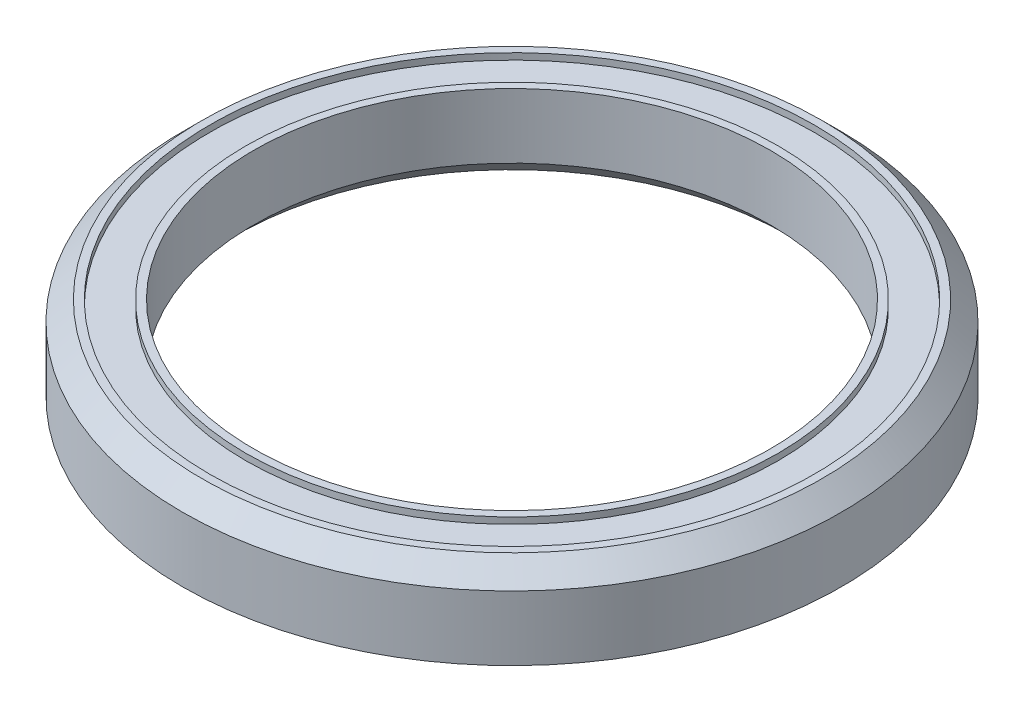
ISO-10303-21;
HEADER;
FILE_DESCRIPTION(('STEP AP214'),'2;1');
FILE_NAME('part.step','',(''),(''),'','','');
FILE_SCHEMA(('AUTOMOTIVE_DESIGN { 1 0 10303 214 1 1 1 1 }'));
ENDSEC;
DATA;
#1=APPLICATION_CONTEXT('core data for automotive mechanical design processes');
#2=APPLICATION_PROTOCOL_DEFINITION('international standard','automotive_design',2000,#1);
#3=PRODUCT_CONTEXT('',#1,'mechanical');
#4=PRODUCT('Part','Part','',(#3));
#5=PRODUCT_RELATED_PRODUCT_CATEGORY('part','',(#4));
#6=PRODUCT_DEFINITION_FORMATION('','',#4);
#7=PRODUCT_DEFINITION_CONTEXT('part definition',#1,'design');
#8=PRODUCT_DEFINITION('design','',#6,#7);
#9=PRODUCT_DEFINITION_SHAPE('','',#8);
#10=(LENGTH_UNIT() NAMED_UNIT(*) SI_UNIT(.MILLI.,.METRE.));
#11=(NAMED_UNIT(*) PLANE_ANGLE_UNIT() SI_UNIT($,.RADIAN.));
#12=(NAMED_UNIT(*) SI_UNIT($,.STERADIAN.) SOLID_ANGLE_UNIT());
#13=UNCERTAINTY_MEASURE_WITH_UNIT(LENGTH_MEASURE(1.E-05),#10,'distance_accuracy_value','');
#14=(GEOMETRIC_REPRESENTATION_CONTEXT(3) GLOBAL_UNCERTAINTY_ASSIGNED_CONTEXT((#13)) GLOBAL_UNIT_ASSIGNED_CONTEXT((#10,
#11,#12)) REPRESENTATION_CONTEXT('',''));
#15=CARTESIAN_POINT('',(0.,0.,0.));
#16=DIRECTION('',(0.,0.,1.));
#17=DIRECTION('',(1.,0.,0.));
#18=AXIS2_PLACEMENT_3D('',#15,#16,#17);
#19=CARTESIAN_POINT('',(0.,0.,0.));
#20=DIRECTION('',(0.,1.,0.));
#21=DIRECTION('',(0.,0.,1.));
#22=AXIS2_PLACEMENT_3D('',#19,#20,#21);
#23=PLANE('',#22);
#24=CARTESIAN_POINT('',(0.,0.,0.));
#25=DIRECTION('',(0.,1.,0.));
#26=DIRECTION('',(0.,0.,1.));
#27=AXIS2_PLACEMENT_3D('',#24,#25,#26);
#28=CIRCLE('',#27,21.5);
#29=CARTESIAN_POINT('',(0.,0.,21.5));
#30=VERTEX_POINT('',#29);
#31=EDGE_CURVE('E50',#30,#30,#28,.T.);
#32=ORIENTED_EDGE('',*,*,#31,.T.);
#33=EDGE_LOOP('',(#32));
#34=FACE_BOUND('',#33,.T.);
#35=CARTESIAN_POINT('',(0.,0.,0.));
#36=DIRECTION('',(0.,-1.,0.));
#37=DIRECTION('',(0.,0.,-1.));
#38=AXIS2_PLACEMENT_3D('',#35,#36,#37);
#39=CIRCLE('',#38,22.1);
#40=CARTESIAN_POINT('',(0.,0.,-22.1));
#41=VERTEX_POINT('',#40);
#42=EDGE_CURVE('E99',#41,#41,#39,.T.);
#43=ORIENTED_EDGE('',*,*,#42,.T.);
#44=EDGE_LOOP('',(#43));
#45=FACE_BOUND('',#44,.T.);
#46=ADVANCED_FACE('F41',(#34,#45),#23,.F.);
#47=CARTESIAN_POINT('',(0.,6.5,0.));
#48=DIRECTION('',(0.,1.,0.));
#49=DIRECTION('',(0.,0.,1.));
#50=AXIS2_PLACEMENT_3D('',#47,#48,#49);
#51=PLANE('',#50);
#52=CARTESIAN_POINT('',(0.,6.5,0.));
#53=DIRECTION('',(0.,1.,0.));
#54=DIRECTION('',(0.,0.,1.));
#55=AXIS2_PLACEMENT_3D('',#52,#53,#54);
#56=CIRCLE('',#55,20.);
#57=CARTESIAN_POINT('',(0.,6.5,-20.));
#58=VERTEX_POINT('',#57);
#59=EDGE_CURVE('E70',#58,#58,#56,.T.);
#60=ORIENTED_EDGE('',*,*,#59,.F.);
#61=EDGE_LOOP('',(#60));
#62=FACE_BOUND('',#61,.T.);
#63=CARTESIAN_POINT('',(0.,6.5,0.));
#64=DIRECTION('',(0.,1.,0.));
#65=DIRECTION('',(0.,0.,1.));
#66=AXIS2_PLACEMENT_3D('',#63,#64,#65);
#67=CIRCLE('',#66,20.6);
#68=CARTESIAN_POINT('',(0.,6.5,20.6));
#69=VERTEX_POINT('',#68);
#70=EDGE_CURVE('E83',#69,#69,#67,.T.);
#71=ORIENTED_EDGE('',*,*,#70,.T.);
#72=EDGE_LOOP('',(#71));
#73=FACE_BOUND('',#72,.T.);
#74=ADVANCED_FACE('F141',(#62,#73),#51,.T.);
#75=CARTESIAN_POINT('',(0.,6.5,0.));
#76=DIRECTION('',(0.,1.,0.));
#77=DIRECTION('',(0.,0.,1.));
#78=AXIS2_PLACEMENT_3D('',#75,#76,#77);
#79=CIRCLE('',#78,23.4000000000001);
#80=CARTESIAN_POINT('',(0.,6.5,23.4000000000001));
#81=VERTEX_POINT('',#80);
#82=EDGE_CURVE('E75',#81,#81,#79,.T.);
#83=ORIENTED_EDGE('',*,*,#82,.F.);
#84=EDGE_LOOP('',(#83));
#85=FACE_BOUND('',#84,.T.);
#86=CARTESIAN_POINT('',(0.,6.5,0.));
#87=DIRECTION('',(0.,1.,0.));
#88=DIRECTION('',(0.,0.,1.));
#89=AXIS2_PLACEMENT_3D('',#86,#87,#88);
#90=CIRCLE('',#89,24.0000000000001);
#91=CARTESIAN_POINT('',(0.,6.5,-24.0000000000001));
#92=VERTEX_POINT('',#91);
#93=EDGE_CURVE('E60',#92,#92,#90,.T.);
#94=ORIENTED_EDGE('',*,*,#93,.T.);
#95=EDGE_LOOP('',(#94));
#96=FACE_BOUND('',#95,.T.);
#97=ADVANCED_FACE('F127',(#85,#96),#51,.T.);
#98=CARTESIAN_POINT('',(0.,0.,0.));
#99=DIRECTION('',(0.,-1.,0.));
#100=DIRECTION('',(0.,0.,-1.));
#101=AXIS2_PLACEMENT_3D('',#98,#99,#100);
#102=CIRCLE('',#101,24.9);
#103=CARTESIAN_POINT('',(0.,0.,-24.9));
#104=VERTEX_POINT('',#103);
#105=EDGE_CURVE('E91',#104,#104,#102,.T.);
#106=ORIENTED_EDGE('',*,*,#105,.F.);
#107=EDGE_LOOP('',(#106));
#108=FACE_BOUND('',#107,.T.);
#109=CARTESIAN_POINT('',(0.,0.,0.));
#110=DIRECTION('',(0.,1.,0.));
#111=DIRECTION('',(0.,0.,1.));
#112=AXIS2_PLACEMENT_3D('',#109,#110,#111);
#113=CIRCLE('',#112,25.5);
#114=CARTESIAN_POINT('',(0.,0.,-25.5));
#115=VERTEX_POINT('',#114);
#116=EDGE_CURVE('E66',#115,#115,#113,.T.);
#117=ORIENTED_EDGE('',*,*,#116,.F.);
#118=EDGE_LOOP('',(#117));
#119=FACE_BOUND('',#118,.T.);
#120=ADVANCED_FACE('F123',(#108,#119),#23,.F.);
#121=CARTESIAN_POINT('',(0.,6.5,0.));
#122=DIRECTION('',(0.,-1.,0.));
#123=DIRECTION('',(0.,0.,-1.));
#124=AXIS2_PLACEMENT_3D('',#121,#122,#123);
#125=CYLINDRICAL_SURFACE('',#124,25.5);
#126=CARTESIAN_POINT('',(0.,5.00000000000004,0.));
#127=DIRECTION('',(0.,1.,0.));
#128=DIRECTION('',(0.,0.,1.));
#129=AXIS2_PLACEMENT_3D('',#126,#127,#128);
#130=CIRCLE('',#129,25.5);
#131=CARTESIAN_POINT('',(0.,5.00000000000004,-25.5));
#132=VERTEX_POINT('',#131);
#133=EDGE_CURVE('E55',#132,#132,#130,.F.);
#134=CARTESIAN_POINT('',(0.,5.00000000000004,-25.5));
#135=CARTESIAN_POINT('',(0.,4.94791666666671,-25.5));
#136=CARTESIAN_POINT('',(0.,4.89583333333338,-25.5));
#137=CARTESIAN_POINT('',(0.,4.79166666666671,-25.5));
#138=CARTESIAN_POINT('',(0.,4.73958333333337,-25.5));
#139=CARTESIAN_POINT('',(0.,4.63541666666671,-25.5));
#140=CARTESIAN_POINT('',(0.,4.58333333333337,-25.5));
#141=CARTESIAN_POINT('',(0.,4.47916666666671,-25.5));
#142=CARTESIAN_POINT('',(0.,4.42708333333337,-25.5));
#143=CARTESIAN_POINT('',(0.,4.32291666666671,-25.5));
#144=CARTESIAN_POINT('',(0.,4.27083333333337,-25.5));
#145=CARTESIAN_POINT('',(0.,4.1666666666667,-25.5));
#146=CARTESIAN_POINT('',(0.,4.11458333333337,-25.5));
#147=CARTESIAN_POINT('',(0.,4.0104166666667,-25.5));
#148=CARTESIAN_POINT('',(0.,3.95833333333337,-25.5));
#149=CARTESIAN_POINT('',(0.,3.8541666666667,-25.5));
#150=CARTESIAN_POINT('',(0.,3.80208333333337,-25.5));
#151=CARTESIAN_POINT('',(0.,3.6979166666667,-25.5));
#152=CARTESIAN_POINT('',(0.,3.64583333333336,-25.5));
#153=CARTESIAN_POINT('',(0.,3.5416666666667,-25.5));
#154=CARTESIAN_POINT('',(0.,3.48958333333336,-25.5));
#155=CARTESIAN_POINT('',(0.,3.3854166666667,-25.5));
#156=CARTESIAN_POINT('',(0.,3.33333333333336,-25.5));
#157=CARTESIAN_POINT('',(0.,3.22916666666669,-25.5));
#158=CARTESIAN_POINT('',(0.,3.17708333333336,-25.5));
#159=CARTESIAN_POINT('',(0.,3.07291666666669,-25.5));
#160=CARTESIAN_POINT('',(0.,3.02083333333336,-25.5));
#161=CARTESIAN_POINT('',(0.,2.91666666666669,-25.5));
#162=CARTESIAN_POINT('',(0.,2.86458333333336,-25.5));
#163=CARTESIAN_POINT('',(0.,2.76041666666669,-25.5));
#164=CARTESIAN_POINT('',(0.,2.70833333333336,-25.5));
#165=CARTESIAN_POINT('',(0.,2.60416666666669,-25.5));
#166=CARTESIAN_POINT('',(0.,2.55208333333335,-25.5));
#167=CARTESIAN_POINT('',(0.,2.44791666666669,-25.5));
#168=CARTESIAN_POINT('',(0.,2.39583333333335,-25.5));
#169=CARTESIAN_POINT('',(0.,2.29166666666669,-25.5));
#170=CARTESIAN_POINT('',(0.,2.23958333333335,-25.5));
#171=CARTESIAN_POINT('',(0.,2.13541666666669,-25.5));
#172=CARTESIAN_POINT('',(0.,2.08333333333335,-25.5));
#173=CARTESIAN_POINT('',(0.,1.97916666666668,-25.5));
#174=CARTESIAN_POINT('',(0.,1.92708333333335,-25.5));
#175=CARTESIAN_POINT('',(0.,1.82291666666668,-25.5));
#176=CARTESIAN_POINT('',(0.,1.77083333333335,-25.5));
#177=CARTESIAN_POINT('',(0.,1.66666666666668,-25.5));
#178=CARTESIAN_POINT('',(0.,1.61458333333335,-25.5));
#179=CARTESIAN_POINT('',(0.,1.51041666666668,-25.5));
#180=CARTESIAN_POINT('',(0.,1.45833333333335,-25.5));
#181=CARTESIAN_POINT('',(0.,1.35416666666668,-25.5));
#182=CARTESIAN_POINT('',(0.,1.30208333333334,-25.5));
#183=CARTESIAN_POINT('',(0.,1.19791666666668,-25.5));
#184=CARTESIAN_POINT('',(0.,1.14583333333334,-25.5));
#185=CARTESIAN_POINT('',(0.,1.04166666666668,-25.5));
#186=CARTESIAN_POINT('',(0.,0.989583333333342,-25.5));
#187=CARTESIAN_POINT('',(0.,0.885416666666674,-25.5));
#188=CARTESIAN_POINT('',(0.,0.83333333333334,-25.5));
#189=CARTESIAN_POINT('',(0.,0.729166666666673,-25.5));
#190=CARTESIAN_POINT('',(0.,0.677083333333339,-25.5));
#191=CARTESIAN_POINT('',(0.,0.572916666666672,-25.5));
#192=CARTESIAN_POINT('',(0.,0.520833333333338,-25.5));
#193=CARTESIAN_POINT('',(0.,0.41666666666667,-25.5));
#194=CARTESIAN_POINT('',(0.,0.364583333333336,-25.5));
#195=CARTESIAN_POINT('',(0.,0.260416666666668,-25.5));
#196=CARTESIAN_POINT('',(0.,0.208333333333334,-25.5));
#197=CARTESIAN_POINT('',(0.,0.104166666666667,-25.5));
#198=CARTESIAN_POINT('',(0.,0.0520833333333334,-25.5));
#199=CARTESIAN_POINT('',(0.,0.,-25.5));
#200=B_SPLINE_CURVE_WITH_KNOTS('',3,(#134,#135,#136,#137,#138,#139,#140,#141,#142,#143,#144,
#145,#146,#147,#148,#149,#150,#151,#152,#153,#154,#155,#156,#157,#158,#159,#160,#161,#162,#163,
#164,#165,#166,#167,#168,#169,#170,#171,#172,#173,#174,#175,#176,#177,#178,#179,#180,#181,#182,
#183,#184,#185,#186,#187,#188,#189,#190,#191,#192,#193,#194,#195,#196,#197,#198,#199),
.UNSPECIFIED.,.F.,.F.,(4,2,2,2,2,2,2,2,2,2,2,2,2,2,2,2,2,2,2,2,2,2,2,2,2,2,2,2,2,2,2,2,4),(0.,
0.156250000000002,0.312500000000003,0.468750000000005,0.625000000000005,0.781250000000007,
0.937500000000009,1.09375000000001,1.25000000000001,1.40625000000001,1.56250000000001,
1.71875000000001,1.87500000000002,2.03125000000002,2.18750000000002,2.34375000000002,
2.50000000000002,2.65625000000002,2.81250000000002,2.96875000000003,3.12500000000003,
3.28125000000003,3.43750000000003,3.59375000000003,3.75000000000003,3.90625000000003,
4.06250000000004,4.21875000000004,4.37500000000004,4.53125000000004,4.68750000000004,
4.84375000000004,5.00000000000004),.UNSPECIFIED.);
#201=EDGE_CURVE('BSEAM126',#132,#115,#200,.T.);
#202=ORIENTED_EDGE('',*,*,#133,.T.);
#203=ORIENTED_EDGE('',*,*,#116,.T.);
#204=ORIENTED_EDGE('',*,*,#201,.T.);
#205=ORIENTED_EDGE('',*,*,#201,.F.);
#206=EDGE_LOOP('',(#202,#204,#203,#205));
#207=FACE_BOUND('',#206,.T.);
#208=ADVANCED_FACE('F126',(#207),#125,.T.);
#209=CARTESIAN_POINT('',(0.,6.5,0.));
#210=DIRECTION('',(0.,-1.,0.));
#211=DIRECTION('',(0.,0.,-1.));
#212=AXIS2_PLACEMENT_3D('',#209,#210,#211);
#213=CYLINDRICAL_SURFACE('',#212,20.);
#214=CARTESIAN_POINT('',(0.,1.49999999999997,0.));
#215=DIRECTION('',(0.,1.,0.));
#216=DIRECTION('',(0.,0.,1.));
#217=AXIS2_PLACEMENT_3D('',#214,#215,#216);
#218=CIRCLE('',#217,20.);
#219=CARTESIAN_POINT('',(0.,1.49999999999997,-20.));
#220=VERTEX_POINT('',#219);
#221=EDGE_CURVE('E10',#220,#220,#218,.F.);
#222=CARTESIAN_POINT('',(0.,1.49999999999997,-20.));
#223=CARTESIAN_POINT('',(0.,1.5520833333333,-20.));
#224=CARTESIAN_POINT('',(0.,1.60416666666664,-20.));
#225=CARTESIAN_POINT('',(0.,1.7083333333333,-20.));
#226=CARTESIAN_POINT('',(0.,1.76041666666664,-20.));
#227=CARTESIAN_POINT('',(0.,1.86458333333331,-20.));
#228=CARTESIAN_POINT('',(0.,1.91666666666664,-20.));
#229=CARTESIAN_POINT('',(0.,2.02083333333331,-20.));
#230=CARTESIAN_POINT('',(0.,2.07291666666664,-20.));
#231=CARTESIAN_POINT('',(0.,2.17708333333331,-20.));
#232=CARTESIAN_POINT('',(0.,2.22916666666664,-20.));
#233=CARTESIAN_POINT('',(0.,2.33333333333331,-20.));
#234=CARTESIAN_POINT('',(0.,2.38541666666664,-20.));
#235=CARTESIAN_POINT('',(0.,2.48958333333331,-20.));
#236=CARTESIAN_POINT('',(0.,2.54166666666664,-20.));
#237=CARTESIAN_POINT('',(0.,2.64583333333331,-20.));
#238=CARTESIAN_POINT('',(0.,2.69791666666664,-20.));
#239=CARTESIAN_POINT('',(0.,2.80208333333331,-20.));
#240=CARTESIAN_POINT('',(0.,2.85416666666664,-20.));
#241=CARTESIAN_POINT('',(0.,2.95833333333331,-20.));
#242=CARTESIAN_POINT('',(0.,3.01041666666665,-20.));
#243=CARTESIAN_POINT('',(0.,3.11458333333331,-20.));
#244=CARTESIAN_POINT('',(0.,3.16666666666665,-20.));
#245=CARTESIAN_POINT('',(0.,3.27083333333331,-20.));
#246=CARTESIAN_POINT('',(0.,3.32291666666665,-20.));
#247=CARTESIAN_POINT('',(0.,3.42708333333331,-20.));
#248=CARTESIAN_POINT('',(0.,3.47916666666665,-20.));
#249=CARTESIAN_POINT('',(0.,3.58333333333332,-20.));
#250=CARTESIAN_POINT('',(0.,3.63541666666665,-20.));
#251=CARTESIAN_POINT('',(0.,3.73958333333332,-20.));
#252=CARTESIAN_POINT('',(0.,3.79166666666665,-20.));
#253=CARTESIAN_POINT('',(0.,3.89583333333332,-20.));
#254=CARTESIAN_POINT('',(0.,3.94791666666665,-20.));
#255=CARTESIAN_POINT('',(0.,4.05208333333332,-20.));
#256=CARTESIAN_POINT('',(0.,4.10416666666665,-20.));
#257=CARTESIAN_POINT('',(0.,4.20833333333332,-20.));
#258=CARTESIAN_POINT('',(0.,4.26041666666665,-20.));
#259=CARTESIAN_POINT('',(0.,4.36458333333332,-20.));
#260=CARTESIAN_POINT('',(0.,4.41666666666665,-20.));
#261=CARTESIAN_POINT('',(0.,4.52083333333332,-20.));
#262=CARTESIAN_POINT('',(0.,4.57291666666665,-20.));
#263=CARTESIAN_POINT('',(0.,4.67708333333332,-20.));
#264=CARTESIAN_POINT('',(0.,4.72916666666665,-20.));
#265=CARTESIAN_POINT('',(0.,4.83333333333332,-20.));
#266=CARTESIAN_POINT('',(0.,4.88541666666666,-20.));
#267=CARTESIAN_POINT('',(0.,4.98958333333332,-20.));
#268=CARTESIAN_POINT('',(0.,5.04166666666666,-20.));
#269=CARTESIAN_POINT('',(0.,5.14583333333332,-20.));
#270=CARTESIAN_POINT('',(0.,5.19791666666666,-20.));
#271=CARTESIAN_POINT('',(0.,5.30208333333333,-20.));
#272=CARTESIAN_POINT('',(0.,5.35416666666666,-20.));
#273=CARTESIAN_POINT('',(0.,5.45833333333333,-20.));
#274=CARTESIAN_POINT('',(0.,5.51041666666666,-20.));
#275=CARTESIAN_POINT('',(0.,5.61458333333333,-20.));
#276=CARTESIAN_POINT('',(0.,5.66666666666666,-20.));
#277=CARTESIAN_POINT('',(0.,5.77083333333333,-20.));
#278=CARTESIAN_POINT('',(0.,5.82291666666666,-20.));
#279=CARTESIAN_POINT('',(0.,5.92708333333333,-20.));
#280=CARTESIAN_POINT('',(0.,5.97916666666666,-20.));
#281=CARTESIAN_POINT('',(0.,6.08333333333333,-20.));
#282=CARTESIAN_POINT('',(0.,6.13541666666666,-20.));
#283=CARTESIAN_POINT('',(0.,6.23958333333333,-20.));
#284=CARTESIAN_POINT('',(0.,6.29166666666666,-20.));
#285=CARTESIAN_POINT('',(0.,6.39583333333333,-20.));
#286=CARTESIAN_POINT('',(0.,6.44791666666667,-20.));
#287=CARTESIAN_POINT('',(0.,6.5,-20.));
#288=B_SPLINE_CURVE_WITH_KNOTS('',3,(#222,#223,#224,#225,#226,#227,#228,#229,#230,#231,#232,
#233,#234,#235,#236,#237,#238,#239,#240,#241,#242,#243,#244,#245,#246,#247,#248,#249,#250,#251,
#252,#253,#254,#255,#256,#257,#258,#259,#260,#261,#262,#263,#264,#265,#266,#267,#268,#269,#270,
#271,#272,#273,#274,#275,#276,#277,#278,#279,#280,#281,#282,#283,#284,#285,#286,#287),
.UNSPECIFIED.,.F.,.F.,(4,2,2,2,2,2,2,2,2,2,2,2,2,2,2,2,2,2,2,2,2,2,2,2,2,2,2,2,2,2,2,2,4),(0.,
0.156250000000001,0.312500000000002,0.468750000000003,0.625000000000004,0.781250000000004,
0.937500000000006,1.09375000000001,1.25000000000001,1.40625000000001,1.56250000000001,
1.71875000000001,1.87500000000001,2.03125000000001,2.18750000000001,2.34375000000001,
2.50000000000001,2.65625000000002,2.81250000000002,2.96875000000002,3.12500000000002,
3.28125000000002,3.43750000000002,3.59375000000002,3.75000000000002,3.90625000000002,
4.06250000000002,4.21875000000002,4.37500000000002,4.53125000000003,4.68750000000003,
4.84375000000003,5.00000000000003),.UNSPECIFIED.);
#289=EDGE_CURVE('BSEAM132',#220,#58,#288,.T.);
#290=ORIENTED_EDGE('',*,*,#221,.T.);
#291=ORIENTED_EDGE('',*,*,#59,.T.);
#292=ORIENTED_EDGE('',*,*,#289,.T.);
#293=ORIENTED_EDGE('',*,*,#289,.F.);
#294=EDGE_LOOP('',(#290,#292,#291,#293));
#295=FACE_BOUND('',#294,.T.);
#296=ADVANCED_FACE('F132',(#295),#213,.F.);
#297=CARTESIAN_POINT('',(0.,6.5,0.));
#298=DIRECTION('',(0.,-1.,0.));
#299=DIRECTION('',(0.,0.,-1.));
#300=AXIS2_PLACEMENT_3D('',#297,#298,#299);
#301=CONICAL_SURFACE('',#300,24.0000000000001,0.785398163397445);
#302=CARTESIAN_POINT('',(0.,5.00000000000004,-25.5));
#303=CARTESIAN_POINT('',(0.,5.01562500000004,-25.484375));
#304=CARTESIAN_POINT('',(0.,5.03125000000004,-25.46875));
#305=CARTESIAN_POINT('',(0.,5.06250000000004,-25.4375));
#306=CARTESIAN_POINT('',(0.,5.07812500000004,-25.421875));
#307=CARTESIAN_POINT('',(0.,5.10937500000004,-25.390625));
#308=CARTESIAN_POINT('',(0.,5.12500000000004,-25.375));
#309=CARTESIAN_POINT('',(0.,5.15625000000004,-25.34375));
#310=CARTESIAN_POINT('',(0.,5.17187500000004,-25.328125));
#311=CARTESIAN_POINT('',(0.,5.20312500000004,-25.296875));
#312=CARTESIAN_POINT('',(0.,5.21875000000004,-25.28125));
#313=CARTESIAN_POINT('',(0.,5.25000000000004,-25.25));
#314=CARTESIAN_POINT('',(0.,5.26562500000004,-25.234375));
#315=CARTESIAN_POINT('',(0.,5.29687500000003,-25.203125));
#316=CARTESIAN_POINT('',(0.,5.31250000000003,-25.1875));
#317=CARTESIAN_POINT('',(0.,5.34375000000003,-25.15625));
#318=CARTESIAN_POINT('',(0.,5.35937500000003,-25.140625));
#319=CARTESIAN_POINT('',(0.,5.39062500000003,-25.109375));
#320=CARTESIAN_POINT('',(0.,5.40625000000003,-25.09375));
#321=CARTESIAN_POINT('',(0.,5.43750000000003,-25.0625));
#322=CARTESIAN_POINT('',(0.,5.45312500000003,-25.046875));
#323=CARTESIAN_POINT('',(0.,5.48437500000003,-25.015625));
#324=CARTESIAN_POINT('',(0.,5.50000000000003,-25.));
#325=CARTESIAN_POINT('',(0.,5.53125000000003,-24.96875));
#326=CARTESIAN_POINT('',(0.,5.54687500000003,-24.953125));
#327=CARTESIAN_POINT('',(0.,5.57812500000003,-24.921875));
#328=CARTESIAN_POINT('',(0.,5.59375000000003,-24.90625));
#329=CARTESIAN_POINT('',(0.,5.62500000000002,-24.875));
#330=CARTESIAN_POINT('',(0.,5.64062500000002,-24.859375));
#331=CARTESIAN_POINT('',(0.,5.67187500000002,-24.828125));
#332=CARTESIAN_POINT('',(0.,5.68750000000002,-24.8125));
#333=CARTESIAN_POINT('',(0.,5.71875000000002,-24.78125));
#334=CARTESIAN_POINT('',(0.,5.73437500000002,-24.765625));
#335=CARTESIAN_POINT('',(0.,5.76562500000002,-24.734375));
#336=CARTESIAN_POINT('',(0.,5.78125000000002,-24.71875));
#337=CARTESIAN_POINT('',(0.,5.81250000000002,-24.6875));
#338=CARTESIAN_POINT('',(0.,5.82812500000002,-24.671875));
#339=CARTESIAN_POINT('',(0.,5.85937500000002,-24.640625));
#340=CARTESIAN_POINT('',(0.,5.87500000000002,-24.625));
#341=CARTESIAN_POINT('',(0.,5.90625000000002,-24.59375));
#342=CARTESIAN_POINT('',(0.,5.92187500000002,-24.578125));
#343=CARTESIAN_POINT('',(0.,5.95312500000002,-24.546875));
#344=CARTESIAN_POINT('',(0.,5.96875000000002,-24.53125));
#345=CARTESIAN_POINT('',(0.,6.00000000000001,-24.5));
#346=CARTESIAN_POINT('',(0.,6.01562500000001,-24.484375));
#347=CARTESIAN_POINT('',(0.,6.04687500000001,-24.453125));
#348=CARTESIAN_POINT('',(0.,6.06250000000001,-24.4375));
#349=CARTESIAN_POINT('',(0.,6.09375000000001,-24.40625));
#350=CARTESIAN_POINT('',(0.,6.10937500000001,-24.390625));
#351=CARTESIAN_POINT('',(0.,6.14062500000001,-24.359375));
#352=CARTESIAN_POINT('',(0.,6.15625000000001,-24.34375));
#353=CARTESIAN_POINT('',(0.,6.18750000000001,-24.3125));
#354=CARTESIAN_POINT('',(0.,6.20312500000001,-24.296875));
#355=CARTESIAN_POINT('',(0.,6.23437500000001,-24.265625));
#356=CARTESIAN_POINT('',(0.,6.25000000000001,-24.25));
#357=CARTESIAN_POINT('',(0.,6.28125000000001,-24.21875));
#358=CARTESIAN_POINT('',(0.,6.29687500000001,-24.203125));
#359=CARTESIAN_POINT('',(0.,6.328125,-24.171875));
#360=CARTESIAN_POINT('',(0.,6.34375,-24.15625));
#361=CARTESIAN_POINT('',(0.,6.375,-24.125));
#362=CARTESIAN_POINT('',(0.,6.390625,-24.109375));
#363=CARTESIAN_POINT('',(0.,6.421875,-24.078125));
#364=CARTESIAN_POINT('',(0.,6.4375,-24.0625));
#365=CARTESIAN_POINT('',(0.,6.46875,-24.0312500000001));
#366=CARTESIAN_POINT('',(0.,6.484375,-24.015625));
#367=CARTESIAN_POINT('',(0.,6.5,-24.0000000000001));
#368=B_SPLINE_CURVE_WITH_KNOTS('',3,(#302,#303,#304,#305,#306,#307,#308,#309,#310,#311,#312,
#313,#314,#315,#316,#317,#318,#319,#320,#321,#322,#323,#324,#325,#326,#327,#328,#329,#330,#331,
#332,#333,#334,#335,#336,#337,#338,#339,#340,#341,#342,#343,#344,#345,#346,#347,#348,#349,#350,
#351,#352,#353,#354,#355,#356,#357,#358,#359,#360,#361,#362,#363,#364,#365,#366,#367),
.UNSPECIFIED.,.F.,.F.,(4,2,2,2,2,2,2,2,2,2,2,2,2,2,2,2,2,2,2,2,2,2,2,2,2,2,2,2,2,2,2,2,4),(0.,
0.0662912607362364,0.132582521472474,0.19887378220871,0.265165042944946,0.331456303681183,
0.39774756441742,0.464038825153656,0.530330085889893,0.59662134662613,0.662912607362366,
0.729203868098603,0.79549512883484,0.861786389571077,0.928077650307313,0.99436891104355,
1.06066017177979,1.12695143251602,1.19324269325226,1.2595339539885,1.32582521472473,
1.39211647546097,1.45840773619721,1.52469899693344,1.59099025766968,1.65728151840592,
1.72357277914215,1.78986403987839,1.85615530061463,1.92244656135086,1.9887378220871,
2.05502908282334,2.12132034355957),.UNSPECIFIED.);
#369=EDGE_CURVE('BSEAM138',#132,#92,#368,.T.);
#370=ORIENTED_EDGE('',*,*,#133,.F.);
#371=ORIENTED_EDGE('',*,*,#93,.F.);
#372=ORIENTED_EDGE('',*,*,#369,.T.);
#373=ORIENTED_EDGE('',*,*,#369,.F.);
#374=EDGE_LOOP('',(#370,#372,#371,#373));
#375=FACE_BOUND('',#374,.T.);
#376=ADVANCED_FACE('F138',(#375),#301,.T.);
#377=CARTESIAN_POINT('',(0.,0.,0.));
#378=DIRECTION('',(0.,-1.,0.));
#379=DIRECTION('',(0.,0.,-1.));
#380=AXIS2_PLACEMENT_3D('',#377,#378,#379);
#381=CONICAL_SURFACE('',#380,21.5,0.785398163397446);
#382=ORIENTED_EDGE('',*,*,#221,.F.);
#383=EDGE_LOOP('',(#382));
#384=FACE_BOUND('',#383,.T.);
#385=ORIENTED_EDGE('',*,*,#31,.F.);
#386=EDGE_LOOP('',(#385));
#387=FACE_BOUND('',#386,.T.);
#388=ADVANCED_FACE('F44',(#384,#387),#381,.F.);
#389=CARTESIAN_POINT('',(0.,6.,0.));
#390=DIRECTION('',(0.,1.,0.));
#391=DIRECTION('',(0.,0.,1.));
#392=AXIS2_PLACEMENT_3D('',#389,#390,#391);
#393=CYLINDRICAL_SURFACE('',#392,23.4000000000001);
#394=CARTESIAN_POINT('',(0.,6.,0.));
#395=DIRECTION('',(0.,1.,0.));
#396=DIRECTION('',(0.,0.,1.));
#397=AXIS2_PLACEMENT_3D('',#394,#395,#396);
#398=CIRCLE('',#397,23.4000000000001);
#399=CARTESIAN_POINT('',(0.,6.,23.4000000000001));
#400=VERTEX_POINT('',#399);
#401=EDGE_CURVE('E74',#400,#400,#398,.T.);
#402=ORIENTED_EDGE('',*,*,#401,.F.);
#403=EDGE_LOOP('',(#402));
#404=FACE_BOUND('',#403,.T.);
#405=ORIENTED_EDGE('',*,*,#82,.T.);
#406=EDGE_LOOP('',(#405));
#407=FACE_BOUND('',#406,.T.);
#408=ADVANCED_FACE('F151',(#404,#407),#393,.F.);
#409=CARTESIAN_POINT('',(0.,6.,0.));
#410=DIRECTION('',(0.,1.,0.));
#411=DIRECTION('',(0.,0.,1.));
#412=AXIS2_PLACEMENT_3D('',#409,#410,#411);
#413=PLANE('',#412);
#414=CARTESIAN_POINT('',(0.,6.,0.));
#415=DIRECTION('',(0.,1.,0.));
#416=DIRECTION('',(0.,0.,1.));
#417=AXIS2_PLACEMENT_3D('',#414,#415,#416);
#418=CIRCLE('',#417,20.6);
#419=CARTESIAN_POINT('',(0.,6.,20.6));
#420=VERTEX_POINT('',#419);
#421=EDGE_CURVE('E79',#420,#420,#418,.T.);
#422=ORIENTED_EDGE('',*,*,#421,.F.);
#423=EDGE_LOOP('',(#422));
#424=FACE_BOUND('',#423,.T.);
#425=ORIENTED_EDGE('',*,*,#401,.T.);
#426=EDGE_LOOP('',(#425));
#427=FACE_BOUND('',#426,.T.);
#428=ADVANCED_FACE('F154',(#424,#427),#413,.T.);
#429=CARTESIAN_POINT('',(0.,6.,0.));
#430=DIRECTION('',(0.,1.,0.));
#431=DIRECTION('',(0.,0.,1.));
#432=AXIS2_PLACEMENT_3D('',#429,#430,#431);
#433=CYLINDRICAL_SURFACE('',#432,20.6);
#434=ORIENTED_EDGE('',*,*,#421,.T.);
#435=EDGE_LOOP('',(#434));
#436=FACE_BOUND('',#435,.T.);
#437=ORIENTED_EDGE('',*,*,#70,.F.);
#438=EDGE_LOOP('',(#437));
#439=FACE_BOUND('',#438,.T.);
#440=ADVANCED_FACE('F119',(#436,#439),#433,.T.);
#441=CARTESIAN_POINT('',(0.,0.5,0.));
#442=DIRECTION('',(0.,-1.,0.));
#443=DIRECTION('',(0.,0.,-1.));
#444=AXIS2_PLACEMENT_3D('',#441,#442,#443);
#445=CYLINDRICAL_SURFACE('',#444,24.9);
#446=CARTESIAN_POINT('',(0.,0.5,0.));
#447=DIRECTION('',(0.,-1.,0.));
#448=DIRECTION('',(0.,0.,-1.));
#449=AXIS2_PLACEMENT_3D('',#446,#447,#448);
#450=CIRCLE('',#449,24.9);
#451=CARTESIAN_POINT('',(0.,0.5,-24.9));
#452=VERTEX_POINT('',#451);
#453=EDGE_CURVE('E87',#452,#452,#450,.T.);
#454=ORIENTED_EDGE('',*,*,#453,.F.);
#455=EDGE_LOOP('',(#454));
#456=FACE_BOUND('',#455,.T.);
#457=ORIENTED_EDGE('',*,*,#105,.T.);
#458=EDGE_LOOP('',(#457));
#459=FACE_BOUND('',#458,.T.);
#460=ADVANCED_FACE('F113',(#456,#459),#445,.F.);
#461=CARTESIAN_POINT('',(0.,0.5,0.));
#462=DIRECTION('',(0.,-1.,0.));
#463=DIRECTION('',(0.,0.,-1.));
#464=AXIS2_PLACEMENT_3D('',#461,#462,#463);
#465=PLANE('',#464);
#466=CARTESIAN_POINT('',(0.,0.5,0.));
#467=DIRECTION('',(0.,-1.,0.));
#468=DIRECTION('',(0.,0.,-1.));
#469=AXIS2_PLACEMENT_3D('',#466,#467,#468);
#470=CIRCLE('',#469,22.1);
#471=CARTESIAN_POINT('',(0.,0.5,-22.1));
#472=VERTEX_POINT('',#471);
#473=EDGE_CURVE('E95',#472,#472,#470,.T.);
#474=ORIENTED_EDGE('',*,*,#473,.F.);
#475=EDGE_LOOP('',(#474));
#476=FACE_BOUND('',#475,.T.);
#477=ORIENTED_EDGE('',*,*,#453,.T.);
#478=EDGE_LOOP('',(#477));
#479=FACE_BOUND('',#478,.T.);
#480=ADVANCED_FACE('F110',(#476,#479),#465,.T.);
#481=CARTESIAN_POINT('',(0.,0.5,0.));
#482=DIRECTION('',(0.,-1.,0.));
#483=DIRECTION('',(0.,0.,-1.));
#484=AXIS2_PLACEMENT_3D('',#481,#482,#483);
#485=CYLINDRICAL_SURFACE('',#484,22.1);
#486=ORIENTED_EDGE('',*,*,#473,.T.);
#487=EDGE_LOOP('',(#486));
#488=FACE_BOUND('',#487,.T.);
#489=ORIENTED_EDGE('',*,*,#42,.F.);
#490=EDGE_LOOP('',(#489));
#491=FACE_BOUND('',#490,.T.);
#492=ADVANCED_FACE('F107',(#488,#491),#485,.T.);
#493=CLOSED_SHELL('',(#46,#74,#97,#120,#208,#296,#376,#388,#408,#428,#440,#460,#480,#492));
#494=MANIFOLD_SOLID_BREP('B2',#493);
#495=ADVANCED_BREP_SHAPE_REPRESENTATION('',(#18,#494),#14);
#496=SHAPE_DEFINITION_REPRESENTATION(#9,#495);
ENDSEC;
END-ISO-10303-21;
